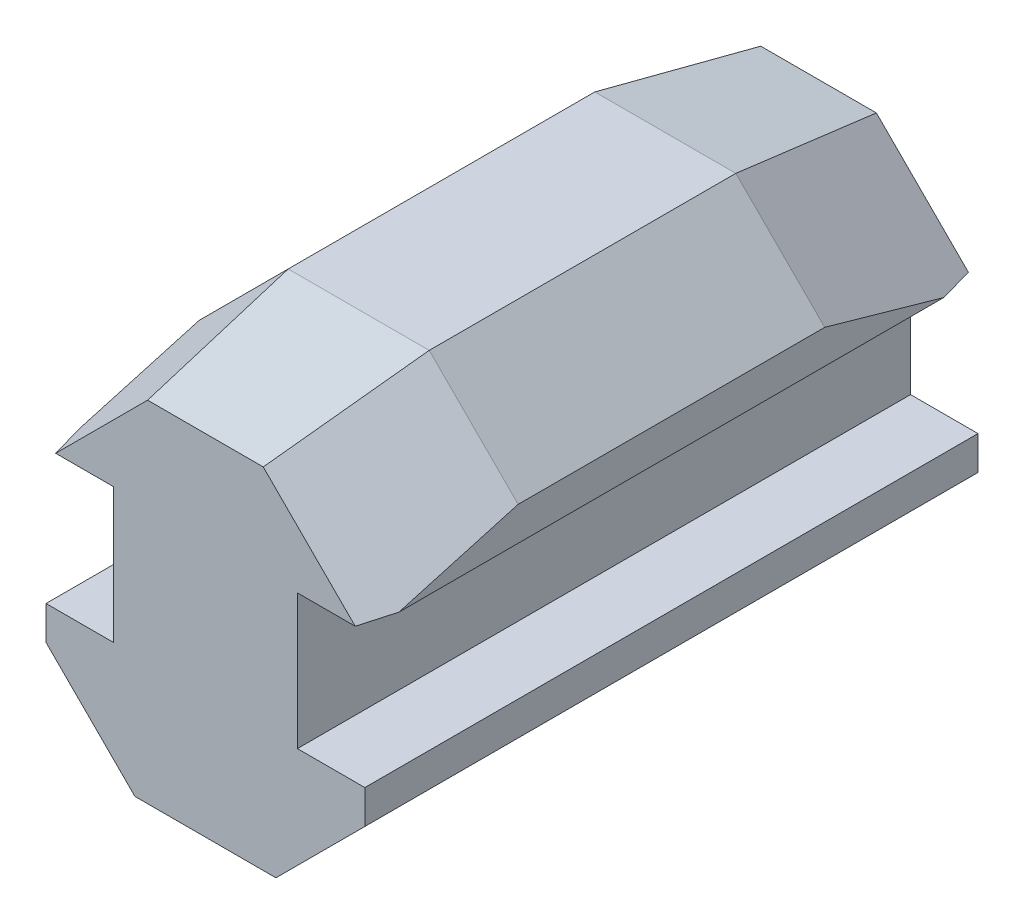
ISO-10303-21;
HEADER;
FILE_DESCRIPTION(('STEP AP214'),'2;1');
FILE_NAME('part.step','',(''),(''),'','','');
FILE_SCHEMA(('AUTOMOTIVE_DESIGN { 1 0 10303 214 1 1 1 1 }'));
ENDSEC;
DATA;
#1=APPLICATION_CONTEXT('core data for automotive mechanical design processes');
#2=APPLICATION_PROTOCOL_DEFINITION('international standard','automotive_design',2000,#1);
#3=PRODUCT_CONTEXT('',#1,'mechanical');
#4=PRODUCT('Part','Part','',(#3));
#5=PRODUCT_RELATED_PRODUCT_CATEGORY('part','',(#4));
#6=PRODUCT_DEFINITION_FORMATION('','',#4);
#7=PRODUCT_DEFINITION_CONTEXT('part definition',#1,'design');
#8=PRODUCT_DEFINITION('design','',#6,#7);
#9=PRODUCT_DEFINITION_SHAPE('','',#8);
#10=(LENGTH_UNIT() NAMED_UNIT(*) SI_UNIT(.MILLI.,.METRE.));
#11=(NAMED_UNIT(*) PLANE_ANGLE_UNIT() SI_UNIT($,.RADIAN.));
#12=(NAMED_UNIT(*) SI_UNIT($,.STERADIAN.) SOLID_ANGLE_UNIT());
#13=UNCERTAINTY_MEASURE_WITH_UNIT(LENGTH_MEASURE(1.E-05),#10,'distance_accuracy_value','');
#14=(GEOMETRIC_REPRESENTATION_CONTEXT(3) GLOBAL_UNCERTAINTY_ASSIGNED_CONTEXT((#13)) GLOBAL_UNIT_ASSIGNED_CONTEXT((#10,
#11,#12)) REPRESENTATION_CONTEXT('',''));
#15=CARTESIAN_POINT('',(0.,0.,0.));
#16=DIRECTION('',(0.,0.,1.));
#17=DIRECTION('',(1.,0.,0.));
#18=AXIS2_PLACEMENT_3D('',#15,#16,#17);
#19=CARTESIAN_POINT('',(-2.29999999999999,6.2,10.));
#20=DIRECTION('',(0.,-1.,0.));
#21=DIRECTION('',(1.,0.,0.));
#22=AXIS2_PLACEMENT_3D('',#19,#20,#21);
#23=PLANE('',#22);
#24=DIRECTION('',(0.,0.,-1.));
#25=VECTOR('',#24,1.);
#26=CARTESIAN_POINT('',(2.29999999999999,6.2,10.));
#27=LINE('',#26,#25);
#28=CARTESIAN_POINT('',(2.29999999999999,6.2,4.99999999999992));
#29=VERTEX_POINT('',#28);
#30=CARTESIAN_POINT('',(2.29999999999999,6.2,-4.99999999999991));
#31=VERTEX_POINT('',#30);
#32=EDGE_CURVE('E243',#29,#31,#27,.T.);
#33=ORIENTED_EDGE('',*,*,#32,.T.);
#34=DIRECTION('',(-1.,0.,0.));
#35=VECTOR('',#34,1.);
#36=CARTESIAN_POINT('',(-2.29999999999999,6.2,-4.99999999999991));
#37=LINE('',#36,#35);
#38=CARTESIAN_POINT('',(-2.29999999999999,6.2,-4.99999999999991));
#39=VERTEX_POINT('',#38);
#40=EDGE_CURVE('E384',#31,#39,#37,.T.);
#41=ORIENTED_EDGE('',*,*,#40,.T.);
#42=DIRECTION('',(0.,0.,-1.));
#43=VECTOR('',#42,1.);
#44=CARTESIAN_POINT('',(-2.29999999999999,6.2,10.));
#45=LINE('',#44,#43);
#46=CARTESIAN_POINT('',(-2.29999999999999,6.2,4.99999999999992));
#47=VERTEX_POINT('',#46);
#48=EDGE_CURVE('E325',#47,#39,#45,.T.);
#49=ORIENTED_EDGE('',*,*,#48,.F.);
#50=DIRECTION('',(1.,0.,0.));
#51=VECTOR('',#50,1.);
#52=CARTESIAN_POINT('',(2.29999999999999,6.2,4.99999999999992));
#53=LINE('',#52,#51);
#54=EDGE_CURVE('E355',#47,#29,#53,.T.);
#55=ORIENTED_EDGE('',*,*,#54,.T.);
#56=EDGE_LOOP('',(#33,#41,#49,#55));
#57=FACE_BOUND('',#56,.T.);
#58=ADVANCED_FACE('F44',(#57),#23,.F.);
#59=CARTESIAN_POINT('',(-5.2,3.3,10.));
#60=DIRECTION('',(0.707106781186546,-0.707106781186549,0.));
#61=DIRECTION('',(0.707106781186549,0.707106781186546,0.));
#62=AXIS2_PLACEMENT_3D('',#59,#60,#61);
#63=PLANE('',#62);
#64=ORIENTED_EDGE('',*,*,#48,.T.);
#65=DIRECTION('',(-0.707106781186549,-0.707106781186546,0.));
#66=VECTOR('',#65,1.);
#67=CARTESIAN_POINT('',(-5.2,3.3,-4.99999999999991));
#68=LINE('',#67,#66);
#69=CARTESIAN_POINT('',(-5.2,3.3,-4.99999999999991));
#70=VERTEX_POINT('',#69);
#71=EDGE_CURVE('E358',#39,#70,#68,.T.);
#72=ORIENTED_EDGE('',*,*,#71,.T.);
#73=DIRECTION('',(0.,0.,-1.));
#74=VECTOR('',#73,1.);
#75=CARTESIAN_POINT('',(-5.2,3.3,10.));
#76=LINE('',#75,#74);
#77=CARTESIAN_POINT('',(-5.2,3.3,4.99999999999992));
#78=VERTEX_POINT('',#77);
#79=EDGE_CURVE('E321',#78,#70,#76,.T.);
#80=ORIENTED_EDGE('',*,*,#79,.F.);
#81=DIRECTION('',(0.707106781186549,0.707106781186546,0.));
#82=VECTOR('',#81,1.);
#83=CARTESIAN_POINT('',(-2.29999999999999,6.2,4.99999999999992));
#84=LINE('',#83,#82);
#85=EDGE_CURVE('E343',#78,#47,#84,.T.);
#86=ORIENTED_EDGE('',*,*,#85,.T.);
#87=EDGE_LOOP('',(#64,#72,#80,#86));
#88=FACE_BOUND('',#87,.T.);
#89=ADVANCED_FACE('F475',(#88),#63,.F.);
#90=CARTESIAN_POINT('',(-5.2,2.2,10.));
#91=DIRECTION('',(1.,0.,0.));
#92=DIRECTION('',(0.,0.,-1.));
#93=AXIS2_PLACEMENT_3D('',#90,#91,#92);
#94=PLANE('',#93);
#95=ORIENTED_EDGE('',*,*,#79,.T.);
#96=DIRECTION('',(0.,0.272165526975904,0.962250448649377));
#97=VECTOR('',#96,1.);
#98=CARTESIAN_POINT('',(-5.2,3.3,-4.99999999999991));
#99=LINE('',#98,#97);
#100=CARTESIAN_POINT('',(-5.2,2.2,-8.88908729652599));
#101=VERTEX_POINT('',#100);
#102=EDGE_CURVE('E369',#70,#101,#99,.F.);
#103=ORIENTED_EDGE('',*,*,#102,.T.);
#104=DIRECTION('',(0.,0.,-1.));
#105=VECTOR('',#104,1.);
#106=CARTESIAN_POINT('',(-5.2,2.2,10.));
#107=LINE('',#106,#105);
#108=CARTESIAN_POINT('',(-5.2,2.2,8.88908729652601));
#109=VERTEX_POINT('',#108);
#110=EDGE_CURVE('E206',#109,#101,#107,.T.);
#111=ORIENTED_EDGE('',*,*,#110,.F.);
#112=DIRECTION('',(0.,0.272165526975904,-0.962250448649378));
#113=VECTOR('',#112,1.);
#114=CARTESIAN_POINT('',(-5.2,2.00853508808517,9.56601798439733));
#115=LINE('',#114,#113);
#116=EDGE_CURVE('E340',#109,#78,#115,.T.);
#117=ORIENTED_EDGE('',*,*,#116,.T.);
#118=EDGE_LOOP('',(#95,#103,#111,#117));
#119=FACE_BOUND('',#118,.T.);
#120=ADVANCED_FACE('F471',(#119),#94,.F.);
#121=CARTESIAN_POINT('',(-3.,2.2,10.));
#122=DIRECTION('',(0.,1.,0.));
#123=DIRECTION('',(-1.,0.,0.));
#124=AXIS2_PLACEMENT_3D('',#121,#122,#123);
#125=PLANE('',#124);
#126=ORIENTED_EDGE('',*,*,#110,.T.);
#127=DIRECTION('',(-0.272165526975905,0.,0.962250448649377));
#128=VECTOR('',#127,1.);
#129=CARTESIAN_POINT('',(-6.21851851851852,2.2,-5.28808054048332));
#130=LINE('',#129,#128);
#131=CARTESIAN_POINT('',(-4.8857864376269,2.2,-10.));
#132=VERTEX_POINT('',#131);
#133=EDGE_CURVE('E372',#101,#132,#130,.F.);
#134=ORIENTED_EDGE('',*,*,#133,.T.);
#135=DIRECTION('',(1.,0.,0.));
#136=VECTOR('',#135,1.);
#137=CARTESIAN_POINT('',(-3.,2.2,-10.));
#138=LINE('',#137,#136);
#139=CARTESIAN_POINT('',(-3.,2.2,-10.));
#140=VERTEX_POINT('',#139);
#141=EDGE_CURVE('E202',#132,#140,#138,.T.);
#142=ORIENTED_EDGE('',*,*,#141,.T.);
#143=DIRECTION('',(0.,0.,-1.));
#144=VECTOR('',#143,1.);
#145=CARTESIAN_POINT('',(-3.,2.2,10.));
#146=LINE('',#145,#144);
#147=CARTESIAN_POINT('',(-3.,2.2,10.));
#148=VERTEX_POINT('',#147);
#149=EDGE_CURVE('E198',#148,#140,#146,.T.);
#150=ORIENTED_EDGE('',*,*,#149,.F.);
#151=DIRECTION('',(1.,0.,0.));
#152=VECTOR('',#151,1.);
#153=CARTESIAN_POINT('',(-3.,2.2,10.));
#154=LINE('',#153,#152);
#155=CARTESIAN_POINT('',(-4.88578643762691,2.2,10.));
#156=VERTEX_POINT('',#155);
#157=EDGE_CURVE('E185',#156,#148,#154,.T.);
#158=ORIENTED_EDGE('',*,*,#157,.F.);
#159=DIRECTION('',(-0.272165526975905,0.,-0.962250448649377));
#160=VECTOR('',#159,1.);
#161=CARTESIAN_POINT('',(-4.78631286586295,2.2,10.3516921857157));
#162=LINE('',#161,#160);
#163=EDGE_CURVE('E337',#156,#109,#162,.T.);
#164=ORIENTED_EDGE('',*,*,#163,.T.);
#165=EDGE_LOOP('',(#126,#134,#142,#150,#158,#164));
#166=FACE_BOUND('',#165,.T.);
#167=ADVANCED_FACE('F200',(#166),#125,.F.);
#168=CARTESIAN_POINT('',(-3.,2.2,10.));
#169=DIRECTION('',(1.,0.,0.));
#170=DIRECTION('',(0.,0.,-1.));
#171=AXIS2_PLACEMENT_3D('',#168,#169,#170);
#172=PLANE('',#171);
#173=DIRECTION('',(0.,-1.,0.));
#174=VECTOR('',#173,1.);
#175=CARTESIAN_POINT('',(-3.,2.2,-10.));
#176=LINE('',#175,#174);
#177=CARTESIAN_POINT('',(-3.,-2.2,-10.));
#178=VERTEX_POINT('',#177);
#179=EDGE_CURVE('E246',#140,#178,#176,.T.);
#180=ORIENTED_EDGE('',*,*,#179,.T.);
#181=DIRECTION('',(0.,0.,-1.));
#182=VECTOR('',#181,1.);
#183=CARTESIAN_POINT('',(-3.,-2.2,10.));
#184=LINE('',#183,#182);
#185=CARTESIAN_POINT('',(-3.,-2.2,10.));
#186=VERTEX_POINT('',#185);
#187=EDGE_CURVE('E207',#186,#178,#184,.T.);
#188=ORIENTED_EDGE('',*,*,#187,.F.);
#189=DIRECTION('',(0.,-1.,0.));
#190=VECTOR('',#189,1.);
#191=CARTESIAN_POINT('',(-3.,2.2,10.));
#192=LINE('',#191,#190);
#193=EDGE_CURVE('E189',#148,#186,#192,.T.);
#194=ORIENTED_EDGE('',*,*,#193,.F.);
#195=ORIENTED_EDGE('',*,*,#149,.T.);
#196=EDGE_LOOP('',(#180,#188,#194,#195));
#197=FACE_BOUND('',#196,.T.);
#198=ADVANCED_FACE('F209',(#197),#172,.F.);
#199=CARTESIAN_POINT('',(-3.,-2.2,10.));
#200=DIRECTION('',(0.,-1.,0.));
#201=DIRECTION('',(1.,0.,0.));
#202=AXIS2_PLACEMENT_3D('',#199,#200,#201);
#203=PLANE('',#202);
#204=DIRECTION('',(-1.,0.,0.));
#205=VECTOR('',#204,1.);
#206=CARTESIAN_POINT('',(-3.,-2.2,-10.));
#207=LINE('',#206,#205);
#208=CARTESIAN_POINT('',(-5.2,-2.2,-10.));
#209=VERTEX_POINT('',#208);
#210=EDGE_CURVE('E250',#178,#209,#207,.T.);
#211=ORIENTED_EDGE('',*,*,#210,.T.);
#212=DIRECTION('',(0.,0.,-1.));
#213=VECTOR('',#212,1.);
#214=CARTESIAN_POINT('',(-5.2,-2.2,10.));
#215=LINE('',#214,#213);
#216=CARTESIAN_POINT('',(-5.2,-2.2,10.));
#217=VERTEX_POINT('',#216);
#218=EDGE_CURVE('E313',#217,#209,#215,.T.);
#219=ORIENTED_EDGE('',*,*,#218,.F.);
#220=DIRECTION('',(-1.,0.,0.));
#221=VECTOR('',#220,1.);
#222=CARTESIAN_POINT('',(-3.,-2.2,10.));
#223=LINE('',#222,#221);
#224=EDGE_CURVE('E213',#186,#217,#223,.T.);
#225=ORIENTED_EDGE('',*,*,#224,.F.);
#226=ORIENTED_EDGE('',*,*,#187,.T.);
#227=EDGE_LOOP('',(#211,#219,#225,#226));
#228=FACE_BOUND('',#227,.T.);
#229=ADVANCED_FACE('F451',(#228),#203,.F.);
#230=CARTESIAN_POINT('',(-5.2,-2.2,10.));
#231=DIRECTION('',(1.,0.,0.));
#232=DIRECTION('',(0.,0.,-1.));
#233=AXIS2_PLACEMENT_3D('',#230,#231,#232);
#234=PLANE('',#233);
#235=DIRECTION('',(0.,-1.,0.));
#236=VECTOR('',#235,1.);
#237=CARTESIAN_POINT('',(-5.2,-2.2,-10.));
#238=LINE('',#237,#236);
#239=CARTESIAN_POINT('',(-5.2,-3.3,-10.));
#240=VERTEX_POINT('',#239);
#241=EDGE_CURVE('E253',#209,#240,#238,.T.);
#242=ORIENTED_EDGE('',*,*,#241,.T.);
#243=DIRECTION('',(0.,0.,-1.));
#244=VECTOR('',#243,1.);
#245=CARTESIAN_POINT('',(-5.2,-3.3,10.));
#246=LINE('',#245,#244);
#247=CARTESIAN_POINT('',(-5.2,-3.3,10.));
#248=VERTEX_POINT('',#247);
#249=EDGE_CURVE('E309',#248,#240,#246,.T.);
#250=ORIENTED_EDGE('',*,*,#249,.F.);
#251=DIRECTION('',(0.,-1.,0.));
#252=VECTOR('',#251,1.);
#253=CARTESIAN_POINT('',(-5.2,-2.2,10.));
#254=LINE('',#253,#252);
#255=EDGE_CURVE('E216',#217,#248,#254,.T.);
#256=ORIENTED_EDGE('',*,*,#255,.F.);
#257=ORIENTED_EDGE('',*,*,#218,.T.);
#258=EDGE_LOOP('',(#242,#250,#256,#257));
#259=FACE_BOUND('',#258,.T.);
#260=ADVANCED_FACE('F447',(#259),#234,.F.);
#261=CARTESIAN_POINT('',(-5.2,-3.3,10.));
#262=DIRECTION('',(0.707106781186546,0.707106781186549,0.));
#263=DIRECTION('',(-0.707106781186549,0.707106781186546,0.));
#264=AXIS2_PLACEMENT_3D('',#261,#262,#263);
#265=PLANE('',#264);
#266=DIRECTION('',(0.707106781186549,-0.707106781186546,0.));
#267=VECTOR('',#266,1.);
#268=CARTESIAN_POINT('',(-5.2,-3.3,-10.));
#269=LINE('',#268,#267);
#270=CARTESIAN_POINT('',(-2.29999999999999,-6.2,-10.));
#271=VERTEX_POINT('',#270);
#272=EDGE_CURVE('E256',#240,#271,#269,.T.);
#273=ORIENTED_EDGE('',*,*,#272,.T.);
#274=DIRECTION('',(0.,0.,-1.));
#275=VECTOR('',#274,1.);
#276=CARTESIAN_POINT('',(-2.29999999999999,-6.2,10.));
#277=LINE('',#276,#275);
#278=CARTESIAN_POINT('',(-2.29999999999999,-6.2,10.));
#279=VERTEX_POINT('',#278);
#280=EDGE_CURVE('E305',#279,#271,#277,.T.);
#281=ORIENTED_EDGE('',*,*,#280,.F.);
#282=DIRECTION('',(0.707106781186549,-0.707106781186546,0.));
#283=VECTOR('',#282,1.);
#284=CARTESIAN_POINT('',(-5.2,-3.3,10.));
#285=LINE('',#284,#283);
#286=EDGE_CURVE('E221',#248,#279,#285,.T.);
#287=ORIENTED_EDGE('',*,*,#286,.F.);
#288=ORIENTED_EDGE('',*,*,#249,.T.);
#289=EDGE_LOOP('',(#273,#281,#287,#288));
#290=FACE_BOUND('',#289,.T.);
#291=ADVANCED_FACE('F443',(#290),#265,.F.);
#292=CARTESIAN_POINT('',(-2.29999999999999,-6.2,10.));
#293=DIRECTION('',(0.,1.,0.));
#294=DIRECTION('',(0.,0.,1.));
#295=AXIS2_PLACEMENT_3D('',#292,#293,#294);
#296=PLANE('',#295);
#297=DIRECTION('',(1.,0.,0.));
#298=VECTOR('',#297,1.);
#299=CARTESIAN_POINT('',(-2.29999999999999,-6.2,-10.));
#300=LINE('',#299,#298);
#301=CARTESIAN_POINT('',(2.29999999999999,-6.2,-10.));
#302=VERTEX_POINT('',#301);
#303=EDGE_CURVE('E259',#271,#302,#300,.T.);
#304=ORIENTED_EDGE('',*,*,#303,.T.);
#305=DIRECTION('',(0.,0.,-1.));
#306=VECTOR('',#305,1.);
#307=CARTESIAN_POINT('',(2.29999999999999,-6.2,10.));
#308=LINE('',#307,#306);
#309=CARTESIAN_POINT('',(2.29999999999999,-6.2,10.));
#310=VERTEX_POINT('',#309);
#311=EDGE_CURVE('E301',#310,#302,#308,.T.);
#312=ORIENTED_EDGE('',*,*,#311,.F.);
#313=DIRECTION('',(1.,0.,0.));
#314=VECTOR('',#313,1.);
#315=CARTESIAN_POINT('',(-2.29999999999999,-6.2,10.));
#316=LINE('',#315,#314);
#317=EDGE_CURVE('E224',#279,#310,#316,.T.);
#318=ORIENTED_EDGE('',*,*,#317,.F.);
#319=ORIENTED_EDGE('',*,*,#280,.T.);
#320=EDGE_LOOP('',(#304,#312,#318,#319));
#321=FACE_BOUND('',#320,.T.);
#322=ADVANCED_FACE('F438',(#321),#296,.F.);
#323=CARTESIAN_POINT('',(5.2,-3.3,10.));
#324=DIRECTION('',(-0.707106781186546,0.707106781186549,0.));
#325=DIRECTION('',(-0.707106781186549,-0.707106781186546,0.));
#326=AXIS2_PLACEMENT_3D('',#323,#324,#325);
#327=PLANE('',#326);
#328=DIRECTION('',(0.707106781186549,0.707106781186546,0.));
#329=VECTOR('',#328,1.);
#330=CARTESIAN_POINT('',(5.2,-3.3,-10.));
#331=LINE('',#330,#329);
#332=CARTESIAN_POINT('',(5.2,-3.3,-10.));
#333=VERTEX_POINT('',#332);
#334=EDGE_CURVE('E262',#302,#333,#331,.T.);
#335=ORIENTED_EDGE('',*,*,#334,.T.);
#336=DIRECTION('',(0.,0.,-1.));
#337=VECTOR('',#336,1.);
#338=CARTESIAN_POINT('',(5.2,-3.3,10.));
#339=LINE('',#338,#337);
#340=CARTESIAN_POINT('',(5.2,-3.3,10.));
#341=VERTEX_POINT('',#340);
#342=EDGE_CURVE('E297',#341,#333,#339,.T.);
#343=ORIENTED_EDGE('',*,*,#342,.F.);
#344=DIRECTION('',(0.707106781186549,0.707106781186546,0.));
#345=VECTOR('',#344,1.);
#346=CARTESIAN_POINT('',(5.2,-3.3,10.));
#347=LINE('',#346,#345);
#348=EDGE_CURVE('E227',#310,#341,#347,.T.);
#349=ORIENTED_EDGE('',*,*,#348,.F.);
#350=ORIENTED_EDGE('',*,*,#311,.T.);
#351=EDGE_LOOP('',(#335,#343,#349,#350));
#352=FACE_BOUND('',#351,.T.);
#353=ADVANCED_FACE('F432',(#352),#327,.F.);
#354=CARTESIAN_POINT('',(5.2,-2.2,10.));
#355=DIRECTION('',(-1.,0.,0.));
#356=DIRECTION('',(0.,0.,1.));
#357=AXIS2_PLACEMENT_3D('',#354,#355,#356);
#358=PLANE('',#357);
#359=DIRECTION('',(0.,1.,0.));
#360=VECTOR('',#359,1.);
#361=CARTESIAN_POINT('',(5.2,-2.2,-10.));
#362=LINE('',#361,#360);
#363=CARTESIAN_POINT('',(5.2,-2.2,-10.));
#364=VERTEX_POINT('',#363);
#365=EDGE_CURVE('E265',#333,#364,#362,.T.);
#366=ORIENTED_EDGE('',*,*,#365,.T.);
#367=DIRECTION('',(0.,0.,-1.));
#368=VECTOR('',#367,1.);
#369=CARTESIAN_POINT('',(5.2,-2.2,10.));
#370=LINE('',#369,#368);
#371=CARTESIAN_POINT('',(5.2,-2.2,10.));
#372=VERTEX_POINT('',#371);
#373=EDGE_CURVE('E293',#372,#364,#370,.T.);
#374=ORIENTED_EDGE('',*,*,#373,.F.);
#375=DIRECTION('',(0.,1.,0.));
#376=VECTOR('',#375,1.);
#377=CARTESIAN_POINT('',(5.2,-2.2,10.));
#378=LINE('',#377,#376);
#379=EDGE_CURVE('E230',#341,#372,#378,.T.);
#380=ORIENTED_EDGE('',*,*,#379,.F.);
#381=ORIENTED_EDGE('',*,*,#342,.T.);
#382=EDGE_LOOP('',(#366,#374,#380,#381));
#383=FACE_BOUND('',#382,.T.);
#384=ADVANCED_FACE('F428',(#383),#358,.F.);
#385=CARTESIAN_POINT('',(3.,-2.2,10.));
#386=DIRECTION('',(0.,-1.,0.));
#387=DIRECTION('',(1.,0.,0.));
#388=AXIS2_PLACEMENT_3D('',#385,#386,#387);
#389=PLANE('',#388);
#390=DIRECTION('',(-1.,0.,0.));
#391=VECTOR('',#390,1.);
#392=CARTESIAN_POINT('',(3.,-2.2,-10.));
#393=LINE('',#392,#391);
#394=CARTESIAN_POINT('',(3.,-2.2,-10.));
#395=VERTEX_POINT('',#394);
#396=EDGE_CURVE('E268',#364,#395,#393,.T.);
#397=ORIENTED_EDGE('',*,*,#396,.T.);
#398=DIRECTION('',(0.,0.,-1.));
#399=VECTOR('',#398,1.);
#400=CARTESIAN_POINT('',(3.,-2.2,10.));
#401=LINE('',#400,#399);
#402=CARTESIAN_POINT('',(3.,-2.2,10.));
#403=VERTEX_POINT('',#402);
#404=EDGE_CURVE('E289',#403,#395,#401,.T.);
#405=ORIENTED_EDGE('',*,*,#404,.F.);
#406=DIRECTION('',(-1.,0.,0.));
#407=VECTOR('',#406,1.);
#408=CARTESIAN_POINT('',(3.,-2.2,10.));
#409=LINE('',#408,#407);
#410=EDGE_CURVE('E233',#372,#403,#409,.T.);
#411=ORIENTED_EDGE('',*,*,#410,.F.);
#412=ORIENTED_EDGE('',*,*,#373,.T.);
#413=EDGE_LOOP('',(#397,#405,#411,#412));
#414=FACE_BOUND('',#413,.T.);
#415=ADVANCED_FACE('F423',(#414),#389,.F.);
#416=CARTESIAN_POINT('',(3.,2.2,10.));
#417=DIRECTION('',(-1.,0.,0.));
#418=DIRECTION('',(0.,0.,1.));
#419=AXIS2_PLACEMENT_3D('',#416,#417,#418);
#420=PLANE('',#419);
#421=DIRECTION('',(0.,1.,0.));
#422=VECTOR('',#421,1.);
#423=CARTESIAN_POINT('',(3.,2.2,-10.));
#424=LINE('',#423,#422);
#425=CARTESIAN_POINT('',(3.,2.2,-10.));
#426=VERTEX_POINT('',#425);
#427=EDGE_CURVE('E271',#395,#426,#424,.T.);
#428=ORIENTED_EDGE('',*,*,#427,.T.);
#429=DIRECTION('',(0.,0.,-1.));
#430=VECTOR('',#429,1.);
#431=CARTESIAN_POINT('',(3.,2.2,10.));
#432=LINE('',#431,#430);
#433=CARTESIAN_POINT('',(3.,2.2,10.));
#434=VERTEX_POINT('',#433);
#435=EDGE_CURVE('E285',#434,#426,#432,.T.);
#436=ORIENTED_EDGE('',*,*,#435,.F.);
#437=DIRECTION('',(0.,1.,0.));
#438=VECTOR('',#437,1.);
#439=CARTESIAN_POINT('',(3.,2.2,10.));
#440=LINE('',#439,#438);
#441=EDGE_CURVE('E236',#403,#434,#440,.T.);
#442=ORIENTED_EDGE('',*,*,#441,.F.);
#443=ORIENTED_EDGE('',*,*,#404,.T.);
#444=EDGE_LOOP('',(#428,#436,#442,#443));
#445=FACE_BOUND('',#444,.T.);
#446=ADVANCED_FACE('F417',(#445),#420,.F.);
#447=CARTESIAN_POINT('',(3.,2.2,10.));
#448=DIRECTION('',(0.,1.,0.));
#449=DIRECTION('',(-1.,0.,0.));
#450=AXIS2_PLACEMENT_3D('',#447,#448,#449);
#451=PLANE('',#450);
#452=DIRECTION('',(1.,0.,0.));
#453=VECTOR('',#452,1.);
#454=CARTESIAN_POINT('',(3.,2.2,-10.));
#455=LINE('',#454,#453);
#456=CARTESIAN_POINT('',(4.8857864376269,2.2,-10.));
#457=VERTEX_POINT('',#456);
#458=EDGE_CURVE('E195',#426,#457,#455,.T.);
#459=ORIENTED_EDGE('',*,*,#458,.T.);
#460=DIRECTION('',(-0.272165526975905,0.,-0.962250448649377));
#461=VECTOR('',#460,1.);
#462=CARTESIAN_POINT('',(6.21851851851852,2.2,-5.28808054048332));
#463=LINE('',#462,#461);
#464=CARTESIAN_POINT('',(5.2,2.2,-8.88908729652599));
#465=VERTEX_POINT('',#464);
#466=EDGE_CURVE('E55',#457,#465,#463,.F.);
#467=ORIENTED_EDGE('',*,*,#466,.T.);
#468=DIRECTION('',(0.,0.,-1.));
#469=VECTOR('',#468,1.);
#470=CARTESIAN_POINT('',(5.2,2.2,10.));
#471=LINE('',#470,#469);
#472=CARTESIAN_POINT('',(5.2,2.2,8.88908729652601));
#473=VERTEX_POINT('',#472);
#474=EDGE_CURVE('E282',#473,#465,#471,.T.);
#475=ORIENTED_EDGE('',*,*,#474,.F.);
#476=DIRECTION('',(-0.272165526975905,0.,0.962250448649377));
#477=VECTOR('',#476,1.);
#478=CARTESIAN_POINT('',(4.78631286586295,2.2,10.3516921857157));
#479=LINE('',#478,#477);
#480=CARTESIAN_POINT('',(4.88578643762691,2.2,10.));
#481=VERTEX_POINT('',#480);
#482=EDGE_CURVE('E352',#473,#481,#479,.T.);
#483=ORIENTED_EDGE('',*,*,#482,.T.);
#484=DIRECTION('',(1.,0.,0.));
#485=VECTOR('',#484,1.);
#486=CARTESIAN_POINT('',(3.,2.2,10.));
#487=LINE('',#486,#485);
#488=EDGE_CURVE('E239',#434,#481,#487,.T.);
#489=ORIENTED_EDGE('',*,*,#488,.F.);
#490=ORIENTED_EDGE('',*,*,#435,.T.);
#491=EDGE_LOOP('',(#459,#467,#475,#483,#489,#490));
#492=FACE_BOUND('',#491,.T.);
#493=ADVANCED_FACE('F412',(#492),#451,.F.);
#494=CARTESIAN_POINT('',(5.2,2.2,10.));
#495=DIRECTION('',(-1.,0.,0.));
#496=DIRECTION('',(0.,0.,1.));
#497=AXIS2_PLACEMENT_3D('',#494,#495,#496);
#498=PLANE('',#497);
#499=ORIENTED_EDGE('',*,*,#474,.T.);
#500=DIRECTION('',(0.,-0.272165526975904,-0.962250448649377));
#501=VECTOR('',#500,1.);
#502=CARTESIAN_POINT('',(5.2,3.3,-4.99999999999991));
#503=LINE('',#502,#501);
#504=CARTESIAN_POINT('',(5.2,3.3,-4.99999999999991));
#505=VERTEX_POINT('',#504);
#506=EDGE_CURVE('E11',#465,#505,#503,.F.);
#507=ORIENTED_EDGE('',*,*,#506,.T.);
#508=DIRECTION('',(0.,0.,-1.));
#509=VECTOR('',#508,1.);
#510=CARTESIAN_POINT('',(5.2,3.3,10.));
#511=LINE('',#510,#509);
#512=CARTESIAN_POINT('',(5.2,3.3,4.99999999999992));
#513=VERTEX_POINT('',#512);
#514=EDGE_CURVE('E279',#513,#505,#511,.T.);
#515=ORIENTED_EDGE('',*,*,#514,.F.);
#516=DIRECTION('',(0.,-0.272165526975904,0.962250448649378));
#517=VECTOR('',#516,1.);
#518=CARTESIAN_POINT('',(5.2,2.00853508808517,9.56601798439733));
#519=LINE('',#518,#517);
#520=EDGE_CURVE('E349',#513,#473,#519,.T.);
#521=ORIENTED_EDGE('',*,*,#520,.T.);
#522=EDGE_LOOP('',(#499,#507,#515,#521));
#523=FACE_BOUND('',#522,.T.);
#524=ADVANCED_FACE('F481',(#523),#498,.F.);
#525=CARTESIAN_POINT('',(5.2,3.3,10.));
#526=DIRECTION('',(-0.707106781186546,-0.707106781186549,0.));
#527=DIRECTION('',(0.707106781186549,-0.707106781186546,0.));
#528=AXIS2_PLACEMENT_3D('',#525,#526,#527);
#529=PLANE('',#528);
#530=ORIENTED_EDGE('',*,*,#514,.T.);
#531=DIRECTION('',(-0.707106781186549,0.707106781186546,0.));
#532=VECTOR('',#531,1.);
#533=CARTESIAN_POINT('',(5.2,3.3,-4.99999999999991));
#534=LINE('',#533,#532);
#535=EDGE_CURVE('E387',#505,#31,#534,.T.);
#536=ORIENTED_EDGE('',*,*,#535,.T.);
#537=ORIENTED_EDGE('',*,*,#32,.F.);
#538=DIRECTION('',(0.707106781186549,-0.707106781186546,0.));
#539=VECTOR('',#538,1.);
#540=CARTESIAN_POINT('',(5.2,3.3,4.99999999999992));
#541=LINE('',#540,#539);
#542=EDGE_CURVE('E346',#29,#513,#541,.T.);
#543=ORIENTED_EDGE('',*,*,#542,.T.);
#544=EDGE_LOOP('',(#530,#536,#537,#543));
#545=FACE_BOUND('',#544,.T.);
#546=ADVANCED_FACE('F480',(#545),#529,.F.);
#547=CARTESIAN_POINT('',(0.,0.,10.));
#548=DIRECTION('',(0.,0.,1.));
#549=DIRECTION('',(1.,0.,0.));
#550=AXIS2_PLACEMENT_3D('',#547,#548,#549);
#551=PLANE('',#550);
#552=DIRECTION('',(-1.,0.,0.));
#553=VECTOR('',#552,1.);
#554=CARTESIAN_POINT('',(-2.29999999999999,5.2,10.));
#555=LINE('',#554,#553);
#556=CARTESIAN_POINT('',(1.88578643762689,5.2,10.));
#557=VERTEX_POINT('',#556);
#558=CARTESIAN_POINT('',(-1.8857864376269,5.2,10.));
#559=VERTEX_POINT('',#558);
#560=EDGE_CURVE('E329',#557,#559,#555,.T.);
#561=ORIENTED_EDGE('',*,*,#560,.T.);
#562=DIRECTION('',(-0.707106781186549,-0.707106781186546,0.));
#563=VECTOR('',#562,1.);
#564=CARTESIAN_POINT('',(-4.49289321881345,2.59289321881345,10.));
#565=LINE('',#564,#563);
#566=EDGE_CURVE('E192',#559,#156,#565,.T.);
#567=ORIENTED_EDGE('',*,*,#566,.T.);
#568=ORIENTED_EDGE('',*,*,#157,.T.);
#569=ORIENTED_EDGE('',*,*,#193,.T.);
#570=ORIENTED_EDGE('',*,*,#224,.T.);
#571=ORIENTED_EDGE('',*,*,#255,.T.);
#572=ORIENTED_EDGE('',*,*,#286,.T.);
#573=ORIENTED_EDGE('',*,*,#317,.T.);
#574=ORIENTED_EDGE('',*,*,#348,.T.);
#575=ORIENTED_EDGE('',*,*,#379,.T.);
#576=ORIENTED_EDGE('',*,*,#410,.T.);
#577=ORIENTED_EDGE('',*,*,#441,.T.);
#578=ORIENTED_EDGE('',*,*,#488,.T.);
#579=DIRECTION('',(-0.707106781186549,0.707106781186546,0.));
#580=VECTOR('',#579,1.);
#581=CARTESIAN_POINT('',(1.59289321881344,5.49289321881345,10.));
#582=LINE('',#581,#580);
#583=EDGE_CURVE('E332',#481,#557,#582,.T.);
#584=ORIENTED_EDGE('',*,*,#583,.T.);
#585=EDGE_LOOP('',(#561,#567,#568,#569,#570,#571,#572,#573,#574,#575,#576,#577,#578,#584));
#586=FACE_BOUND('',#585,.T.);
#587=ADVANCED_FACE('F187',(#586),#551,.T.);
#588=CARTESIAN_POINT('',(0.,0.,-10.));
#589=DIRECTION('',(0.,0.,1.));
#590=DIRECTION('',(1.,0.,0.));
#591=AXIS2_PLACEMENT_3D('',#588,#589,#590);
#592=PLANE('',#591);
#593=ORIENTED_EDGE('',*,*,#141,.F.);
#594=DIRECTION('',(0.707106781186549,0.707106781186546,0.));
#595=VECTOR('',#594,1.);
#596=CARTESIAN_POINT('',(-3.54289321881344,3.54289321881346,-10.));
#597=LINE('',#596,#595);
#598=CARTESIAN_POINT('',(-1.88578643762689,5.2,-10.));
#599=VERTEX_POINT('',#598);
#600=EDGE_CURVE('E381',#132,#599,#597,.T.);
#601=ORIENTED_EDGE('',*,*,#600,.T.);
#602=DIRECTION('',(1.,0.,0.));
#603=VECTOR('',#602,1.);
#604=CARTESIAN_POINT('',(0.,5.2,-10.));
#605=LINE('',#604,#603);
#606=CARTESIAN_POINT('',(1.88578643762689,5.2,-10.));
#607=VERTEX_POINT('',#606);
#608=EDGE_CURVE('E378',#599,#607,#605,.T.);
#609=ORIENTED_EDGE('',*,*,#608,.T.);
#610=DIRECTION('',(0.707106781186549,-0.707106781186546,0.));
#611=VECTOR('',#610,1.);
#612=CARTESIAN_POINT('',(3.54289321881344,3.54289321881346,-10.));
#613=LINE('',#612,#611);
#614=EDGE_CURVE('E375',#607,#457,#613,.T.);
#615=ORIENTED_EDGE('',*,*,#614,.T.);
#616=ORIENTED_EDGE('',*,*,#458,.F.);
#617=ORIENTED_EDGE('',*,*,#427,.F.);
#618=ORIENTED_EDGE('',*,*,#396,.F.);
#619=ORIENTED_EDGE('',*,*,#365,.F.);
#620=ORIENTED_EDGE('',*,*,#334,.F.);
#621=ORIENTED_EDGE('',*,*,#303,.F.);
#622=ORIENTED_EDGE('',*,*,#272,.F.);
#623=ORIENTED_EDGE('',*,*,#241,.F.);
#624=ORIENTED_EDGE('',*,*,#210,.F.);
#625=ORIENTED_EDGE('',*,*,#179,.F.);
#626=EDGE_LOOP('',(#593,#601,#609,#615,#616,#617,#618,#619,#620,#621,#622,#623,#624,#625));
#627=FACE_BOUND('',#626,.T.);
#628=ADVANCED_FACE('F410',(#627),#592,.F.);
#629=CARTESIAN_POINT('',(3.54289321881345,3.54289321881346,10.));
#630=DIRECTION('',(0.693375245281536,0.693375245281538,0.196116135138181));
#631=DIRECTION('',(0.707106781186549,-0.707106781186546,0.));
#632=AXIS2_PLACEMENT_3D('',#629,#630,#631);
#633=PLANE('',#632);
#634=ORIENTED_EDGE('',*,*,#520,.F.);
#635=ORIENTED_EDGE('',*,*,#542,.F.);
#636=DIRECTION('',(0.0809672525550495,0.195472239226488,-0.977361196132458));
#637=VECTOR('',#636,1.);
#638=CARTESIAN_POINT('',(1.8734237950467,5.17015394061613,10.1492302969194));
#639=LINE('',#638,#637);
#640=EDGE_CURVE('E247',#557,#29,#639,.T.);
#641=ORIENTED_EDGE('',*,*,#640,.F.);
#642=ORIENTED_EDGE('',*,*,#583,.F.);
#643=ORIENTED_EDGE('',*,*,#482,.F.);
#644=EDGE_LOOP('',(#634,#635,#641,#642,#643));
#645=FACE_BOUND('',#644,.T.);
#646=ADVANCED_FACE('F457',(#645),#633,.T.);
#647=CARTESIAN_POINT('',(0.,5.2,10.));
#648=DIRECTION('',(0.,0.980580675690921,0.196116135138181));
#649=DIRECTION('',(1.,0.,0.));
#650=AXIS2_PLACEMENT_3D('',#647,#648,#649);
#651=PLANE('',#650);
#652=ORIENTED_EDGE('',*,*,#640,.T.);
#653=ORIENTED_EDGE('',*,*,#54,.F.);
#654=DIRECTION('',(0.0809672525550495,-0.195472239226488,0.977361196132458));
#655=VECTOR('',#654,1.);
#656=CARTESIAN_POINT('',(-1.8734237950467,5.17015394061613,10.1492302969194));
#657=LINE('',#656,#655);
#658=EDGE_CURVE('E359',#559,#47,#657,.F.);
#659=ORIENTED_EDGE('',*,*,#658,.F.);
#660=ORIENTED_EDGE('',*,*,#560,.F.);
#661=EDGE_LOOP('',(#652,#653,#659,#660));
#662=FACE_BOUND('',#661,.T.);
#663=ADVANCED_FACE('F463',(#662),#651,.T.);
#664=CARTESIAN_POINT('',(-3.54289321881345,3.54289321881346,10.));
#665=DIRECTION('',(-0.693375245281536,0.693375245281538,0.196116135138181));
#666=DIRECTION('',(0.707106781186549,0.707106781186546,0.));
#667=AXIS2_PLACEMENT_3D('',#664,#665,#666);
#668=PLANE('',#667);
#669=ORIENTED_EDGE('',*,*,#658,.T.);
#670=ORIENTED_EDGE('',*,*,#85,.F.);
#671=ORIENTED_EDGE('',*,*,#116,.F.);
#672=ORIENTED_EDGE('',*,*,#163,.F.);
#673=ORIENTED_EDGE('',*,*,#566,.F.);
#674=EDGE_LOOP('',(#669,#670,#671,#672,#673));
#675=FACE_BOUND('',#674,.T.);
#676=ADVANCED_FACE('F466',(#675),#668,.T.);
#677=CARTESIAN_POINT('',(5.2,3.3,-4.99999999999991));
#678=DIRECTION('',(-0.693375245281536,-0.693375245281538,0.196116135138181));
#679=DIRECTION('',(-0.707106781186549,0.707106781186546,0.));
#680=AXIS2_PLACEMENT_3D('',#677,#678,#679);
#681=PLANE('',#680);
#682=ORIENTED_EDGE('',*,*,#466,.F.);
#683=ORIENTED_EDGE('',*,*,#614,.F.);
#684=DIRECTION('',(0.0809672525550494,0.195472239226488,0.977361196132458));
#685=VECTOR('',#684,1.);
#686=CARTESIAN_POINT('',(2.27311365289354,6.13509061617293,-5.32454691913527));
#687=LINE('',#686,#685);
#688=EDGE_CURVE('E49',#31,#607,#687,.F.);
#689=ORIENTED_EDGE('',*,*,#688,.F.);
#690=ORIENTED_EDGE('',*,*,#535,.F.);
#691=ORIENTED_EDGE('',*,*,#506,.F.);
#692=EDGE_LOOP('',(#682,#683,#689,#690,#691));
#693=FACE_BOUND('',#692,.T.);
#694=ADVANCED_FACE('F47',(#693),#681,.F.);
#695=CARTESIAN_POINT('',(-2.29999999999999,6.2,-4.99999999999991));
#696=DIRECTION('',(0.,-0.980580675690921,0.196116135138181));
#697=DIRECTION('',(-1.,0.,0.));
#698=AXIS2_PLACEMENT_3D('',#695,#696,#697);
#699=PLANE('',#698);
#700=ORIENTED_EDGE('',*,*,#688,.T.);
#701=ORIENTED_EDGE('',*,*,#608,.F.);
#702=DIRECTION('',(-0.0809672525550494,0.195472239226488,0.977361196132458));
#703=VECTOR('',#702,1.);
#704=CARTESIAN_POINT('',(-2.29999999999999,6.2,-4.99999999999991));
#705=LINE('',#704,#703);
#706=EDGE_CURVE('E391',#39,#599,#705,.F.);
#707=ORIENTED_EDGE('',*,*,#706,.F.);
#708=ORIENTED_EDGE('',*,*,#40,.F.);
#709=EDGE_LOOP('',(#700,#701,#707,#708));
#710=FACE_BOUND('',#709,.T.);
#711=ADVANCED_FACE('F404',(#710),#699,.F.);
#712=CARTESIAN_POINT('',(-5.2,3.3,-4.99999999999991));
#713=DIRECTION('',(0.693375245281536,-0.693375245281538,0.196116135138181));
#714=DIRECTION('',(-0.707106781186549,-0.707106781186546,0.));
#715=AXIS2_PLACEMENT_3D('',#712,#713,#714);
#716=PLANE('',#715);
#717=ORIENTED_EDGE('',*,*,#706,.T.);
#718=ORIENTED_EDGE('',*,*,#600,.F.);
#719=ORIENTED_EDGE('',*,*,#133,.F.);
#720=ORIENTED_EDGE('',*,*,#102,.F.);
#721=ORIENTED_EDGE('',*,*,#71,.F.);
#722=EDGE_LOOP('',(#717,#718,#719,#720,#721));
#723=FACE_BOUND('',#722,.T.);
#724=ADVANCED_FACE('F473',(#723),#716,.F.);
#725=CLOSED_SHELL('',(#58,#89,#120,#167,#198,#229,#260,#291,#322,#353,#384,#415,#446,#493,#524,
#546,#587,#628,#646,#663,#676,#694,#711,#724));
#726=MANIFOLD_SOLID_BREP('B2',#725);
#727=ADVANCED_BREP_SHAPE_REPRESENTATION('',(#18,#726),#14);
#728=SHAPE_DEFINITION_REPRESENTATION(#9,#727);
ENDSEC;
END-ISO-10303-21;
